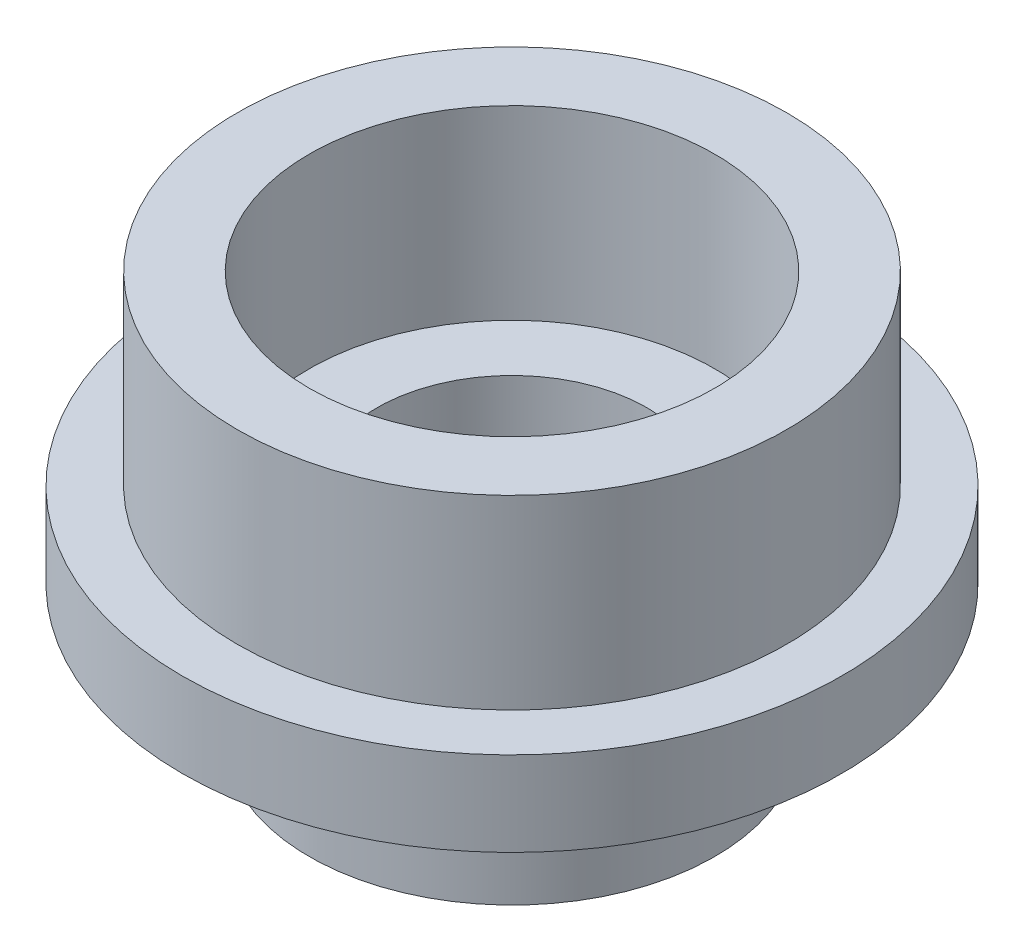
ISO-10303-21;
HEADER;
FILE_DESCRIPTION(('STEP AP214'),'2;1');
FILE_NAME('part.step','',(''),(''),'','','');
FILE_SCHEMA(('AUTOMOTIVE_DESIGN { 1 0 10303 214 1 1 1 1 }'));
ENDSEC;
DATA;
#1=APPLICATION_CONTEXT('core data for automotive mechanical design processes');
#2=APPLICATION_PROTOCOL_DEFINITION('international standard','automotive_design',2000,#1);
#3=PRODUCT_CONTEXT('',#1,'mechanical');
#4=PRODUCT('Part','Part','',(#3));
#5=PRODUCT_RELATED_PRODUCT_CATEGORY('part','',(#4));
#6=PRODUCT_DEFINITION_FORMATION('','',#4);
#7=PRODUCT_DEFINITION_CONTEXT('part definition',#1,'design');
#8=PRODUCT_DEFINITION('design','',#6,#7);
#9=PRODUCT_DEFINITION_SHAPE('','',#8);
#10=(LENGTH_UNIT() NAMED_UNIT(*) SI_UNIT(.MILLI.,.METRE.));
#11=(NAMED_UNIT(*) PLANE_ANGLE_UNIT() SI_UNIT($,.RADIAN.));
#12=(NAMED_UNIT(*) SI_UNIT($,.STERADIAN.) SOLID_ANGLE_UNIT());
#13=UNCERTAINTY_MEASURE_WITH_UNIT(LENGTH_MEASURE(1.E-05),#10,'distance_accuracy_value','');
#14=(GEOMETRIC_REPRESENTATION_CONTEXT(3) GLOBAL_UNCERTAINTY_ASSIGNED_CONTEXT((#13)) GLOBAL_UNIT_ASSIGNED_CONTEXT((#10,
#11,#12)) REPRESENTATION_CONTEXT('',''));
#15=CARTESIAN_POINT('',(0.,0.,0.));
#16=DIRECTION('',(0.,0.,1.));
#17=DIRECTION('',(1.,0.,0.));
#18=AXIS2_PLACEMENT_3D('',#15,#16,#17);
#19=CARTESIAN_POINT('',(0.,2.2,0.));
#20=DIRECTION('',(0.,1.,0.));
#21=DIRECTION('',(0.,0.,1.));
#22=AXIS2_PLACEMENT_3D('',#19,#20,#21);
#23=PLANE('',#22);
#24=CARTESIAN_POINT('',(0.,2.2,0.));
#25=DIRECTION('',(0.,1.,0.));
#26=DIRECTION('',(0.,0.,1.));
#27=AXIS2_PLACEMENT_3D('',#24,#25,#26);
#28=CIRCLE('',#27,3.25);
#29=CARTESIAN_POINT('',(0.,2.2,3.25));
#30=VERTEX_POINT('',#29);
#31=EDGE_CURVE('E10',#30,#30,#28,.T.);
#32=ORIENTED_EDGE('',*,*,#31,.T.);
#33=EDGE_LOOP('',(#32));
#34=FACE_BOUND('',#33,.T.);
#35=CARTESIAN_POINT('',(0.,2.2,0.));
#36=DIRECTION('',(0.,1.,0.));
#37=DIRECTION('',(0.,0.,1.));
#38=AXIS2_PLACEMENT_3D('',#35,#36,#37);
#39=CIRCLE('',#38,2.4);
#40=CARTESIAN_POINT('',(0.,2.2,2.4));
#41=VERTEX_POINT('',#40);
#42=EDGE_CURVE('E43',#41,#41,#39,.T.);
#43=ORIENTED_EDGE('',*,*,#42,.F.);
#44=EDGE_LOOP('',(#43));
#45=FACE_BOUND('',#44,.T.);
#46=ADVANCED_FACE('F35',(#34,#45),#23,.T.);
#47=CARTESIAN_POINT('',(0.,2.2,0.));
#48=DIRECTION('',(0.,-1.,0.));
#49=DIRECTION('',(0.,0.,-1.));
#50=AXIS2_PLACEMENT_3D('',#47,#48,#49);
#51=CYLINDRICAL_SURFACE('',#50,3.25);
#52=ORIENTED_EDGE('',*,*,#31,.F.);
#53=EDGE_LOOP('',(#52));
#54=FACE_BOUND('',#53,.T.);
#55=CARTESIAN_POINT('',(0.,0.,0.));
#56=DIRECTION('',(0.,1.,0.));
#57=DIRECTION('',(0.,0.,1.));
#58=AXIS2_PLACEMENT_3D('',#55,#56,#57);
#59=CIRCLE('',#58,3.25);
#60=CARTESIAN_POINT('',(0.,0.,3.25));
#61=VERTEX_POINT('',#60);
#62=EDGE_CURVE('E51',#61,#61,#59,.T.);
#63=ORIENTED_EDGE('',*,*,#62,.T.);
#64=EDGE_LOOP('',(#63));
#65=FACE_BOUND('',#64,.T.);
#66=ADVANCED_FACE('F37',(#54,#65),#51,.T.);
#67=CARTESIAN_POINT('',(0.,2.2,0.));
#68=DIRECTION('',(0.,-1.,0.));
#69=DIRECTION('',(0.,0.,-1.));
#70=AXIS2_PLACEMENT_3D('',#67,#68,#69);
#71=CYLINDRICAL_SURFACE('',#70,2.4);
#72=ORIENTED_EDGE('',*,*,#42,.T.);
#73=EDGE_LOOP('',(#72));
#74=FACE_BOUND('',#73,.T.);
#75=CARTESIAN_POINT('',(0.,0.,0.));
#76=DIRECTION('',(0.,1.,0.));
#77=DIRECTION('',(0.,0.,1.));
#78=AXIS2_PLACEMENT_3D('',#75,#76,#77);
#79=CIRCLE('',#78,2.4);
#80=CARTESIAN_POINT('',(0.,0.,2.4));
#81=VERTEX_POINT('',#80);
#82=EDGE_CURVE('E48',#81,#81,#79,.T.);
#83=ORIENTED_EDGE('',*,*,#82,.F.);
#84=EDGE_LOOP('',(#83));
#85=FACE_BOUND('',#84,.T.);
#86=ADVANCED_FACE('F96',(#74,#85),#71,.F.);
#87=CARTESIAN_POINT('',(0.,0.,0.));
#88=DIRECTION('',(0.,-1.,0.));
#89=DIRECTION('',(0.,0.,-1.));
#90=AXIS2_PLACEMENT_3D('',#87,#88,#89);
#91=PLANE('',#90);
#92=CARTESIAN_POINT('',(0.,0.,0.));
#93=DIRECTION('',(0.,-1.,0.));
#94=DIRECTION('',(0.,0.,-1.));
#95=AXIS2_PLACEMENT_3D('',#92,#93,#94);
#96=CIRCLE('',#95,1.6);
#97=CARTESIAN_POINT('',(0.,0.,-1.6));
#98=VERTEX_POINT('',#97);
#99=EDGE_CURVE('E39',#98,#98,#96,.T.);
#100=ORIENTED_EDGE('',*,*,#99,.T.);
#101=EDGE_LOOP('',(#100));
#102=FACE_BOUND('',#101,.T.);
#103=ORIENTED_EDGE('',*,*,#82,.T.);
#104=EDGE_LOOP('',(#103));
#105=FACE_BOUND('',#104,.T.);
#106=ADVANCED_FACE('F78',(#102,#105),#91,.F.);
#107=CARTESIAN_POINT('',(0.,-1.,0.));
#108=DIRECTION('',(0.,1.,0.));
#109=DIRECTION('',(0.,0.,1.));
#110=AXIS2_PLACEMENT_3D('',#107,#108,#109);
#111=CYLINDRICAL_SURFACE('',#110,3.9);
#112=CARTESIAN_POINT('',(0.,-1.,0.));
#113=DIRECTION('',(0.,-1.,0.));
#114=DIRECTION('',(0.,0.,-1.));
#115=AXIS2_PLACEMENT_3D('',#112,#113,#114);
#116=CIRCLE('',#115,3.9);
#117=CARTESIAN_POINT('',(0.,-1.,-3.9));
#118=VERTEX_POINT('',#117);
#119=EDGE_CURVE('E53',#118,#118,#116,.T.);
#120=ORIENTED_EDGE('',*,*,#119,.F.);
#121=EDGE_LOOP('',(#120));
#122=FACE_BOUND('',#121,.T.);
#123=CARTESIAN_POINT('',(0.,0.,0.));
#124=DIRECTION('',(0.,-1.,0.));
#125=DIRECTION('',(0.,0.,-1.));
#126=AXIS2_PLACEMENT_3D('',#123,#124,#125);
#127=CIRCLE('',#126,3.9);
#128=CARTESIAN_POINT('',(0.,0.,-3.9));
#129=VERTEX_POINT('',#128);
#130=EDGE_CURVE('E58',#129,#129,#127,.T.);
#131=ORIENTED_EDGE('',*,*,#130,.T.);
#132=EDGE_LOOP('',(#131));
#133=FACE_BOUND('',#132,.T.);
#134=ADVANCED_FACE('F103',(#122,#133),#111,.T.);
#135=CARTESIAN_POINT('',(0.,-1.,0.));
#136=DIRECTION('',(0.,-1.,0.));
#137=DIRECTION('',(0.,0.,-1.));
#138=AXIS2_PLACEMENT_3D('',#135,#136,#137);
#139=PLANE('',#138);
#140=CARTESIAN_POINT('',(0.,-1.,0.));
#141=DIRECTION('',(0.,-1.,0.));
#142=DIRECTION('',(0.,0.,-1.));
#143=AXIS2_PLACEMENT_3D('',#140,#141,#142);
#144=CIRCLE('',#143,2.4);
#145=CARTESIAN_POINT('',(0.,-1.,-2.4));
#146=VERTEX_POINT('',#145);
#147=EDGE_CURVE('E66',#146,#146,#144,.T.);
#148=ORIENTED_EDGE('',*,*,#147,.F.);
#149=EDGE_LOOP('',(#148));
#150=FACE_BOUND('',#149,.T.);
#151=ORIENTED_EDGE('',*,*,#119,.T.);
#152=EDGE_LOOP('',(#151));
#153=FACE_BOUND('',#152,.T.);
#154=ADVANCED_FACE('F106',(#150,#153),#139,.T.);
#155=ORIENTED_EDGE('',*,*,#62,.F.);
#156=EDGE_LOOP('',(#155));
#157=FACE_BOUND('',#156,.T.);
#158=ORIENTED_EDGE('',*,*,#130,.F.);
#159=EDGE_LOOP('',(#158));
#160=FACE_BOUND('',#159,.T.);
#161=ADVANCED_FACE('F108',(#157,#160),#91,.F.);
#162=CARTESIAN_POINT('',(0.,-2.6,0.));
#163=DIRECTION('',(0.,-1.,0.));
#164=DIRECTION('',(0.,0.,-1.));
#165=AXIS2_PLACEMENT_3D('',#162,#163,#164);
#166=PLANE('',#165);
#167=CARTESIAN_POINT('',(0.,-2.6,0.));
#168=DIRECTION('',(0.,-1.,0.));
#169=DIRECTION('',(0.,0.,-1.));
#170=AXIS2_PLACEMENT_3D('',#167,#168,#169);
#171=CIRCLE('',#170,2.4);
#172=CARTESIAN_POINT('',(0.,-2.6,-2.4));
#173=VERTEX_POINT('',#172);
#174=EDGE_CURVE('E63',#173,#173,#171,.T.);
#175=ORIENTED_EDGE('',*,*,#174,.T.);
#176=EDGE_LOOP('',(#175));
#177=FACE_BOUND('',#176,.T.);
#178=CARTESIAN_POINT('',(0.,-2.6,0.));
#179=DIRECTION('',(0.,-1.,0.));
#180=DIRECTION('',(0.,0.,-1.));
#181=AXIS2_PLACEMENT_3D('',#178,#179,#180);
#182=CIRCLE('',#181,1.6);
#183=CARTESIAN_POINT('',(0.,-2.6,-1.6));
#184=VERTEX_POINT('',#183);
#185=EDGE_CURVE('E69',#184,#184,#182,.T.);
#186=ORIENTED_EDGE('',*,*,#185,.F.);
#187=EDGE_LOOP('',(#186));
#188=FACE_BOUND('',#187,.T.);
#189=ADVANCED_FACE('F88',(#177,#188),#166,.T.);
#190=CARTESIAN_POINT('',(0.,-2.6,0.));
#191=DIRECTION('',(0.,1.,0.));
#192=DIRECTION('',(0.,0.,1.));
#193=AXIS2_PLACEMENT_3D('',#190,#191,#192);
#194=CYLINDRICAL_SURFACE('',#193,2.4);
#195=ORIENTED_EDGE('',*,*,#174,.F.);
#196=EDGE_LOOP('',(#195));
#197=FACE_BOUND('',#196,.T.);
#198=ORIENTED_EDGE('',*,*,#147,.T.);
#199=EDGE_LOOP('',(#198));
#200=FACE_BOUND('',#199,.T.);
#201=ADVANCED_FACE('F83',(#197,#200),#194,.T.);
#202=CARTESIAN_POINT('',(0.,-2.6,0.));
#203=DIRECTION('',(0.,1.,0.));
#204=DIRECTION('',(0.,0.,1.));
#205=AXIS2_PLACEMENT_3D('',#202,#203,#204);
#206=CYLINDRICAL_SURFACE('',#205,1.6);
#207=ORIENTED_EDGE('',*,*,#185,.T.);
#208=EDGE_LOOP('',(#207));
#209=FACE_BOUND('',#208,.T.);
#210=ORIENTED_EDGE('',*,*,#99,.F.);
#211=EDGE_LOOP('',(#210));
#212=FACE_BOUND('',#211,.T.);
#213=ADVANCED_FACE('F81',(#209,#212),#206,.F.);
#214=CLOSED_SHELL('',(#46,#66,#86,#106,#134,#154,#161,#189,#201,#213));
#215=MANIFOLD_SOLID_BREP('B2',#214);
#216=ADVANCED_BREP_SHAPE_REPRESENTATION('',(#18,#215),#14);
#217=SHAPE_DEFINITION_REPRESENTATION(#9,#216);
ENDSEC;
END-ISO-10303-21;
